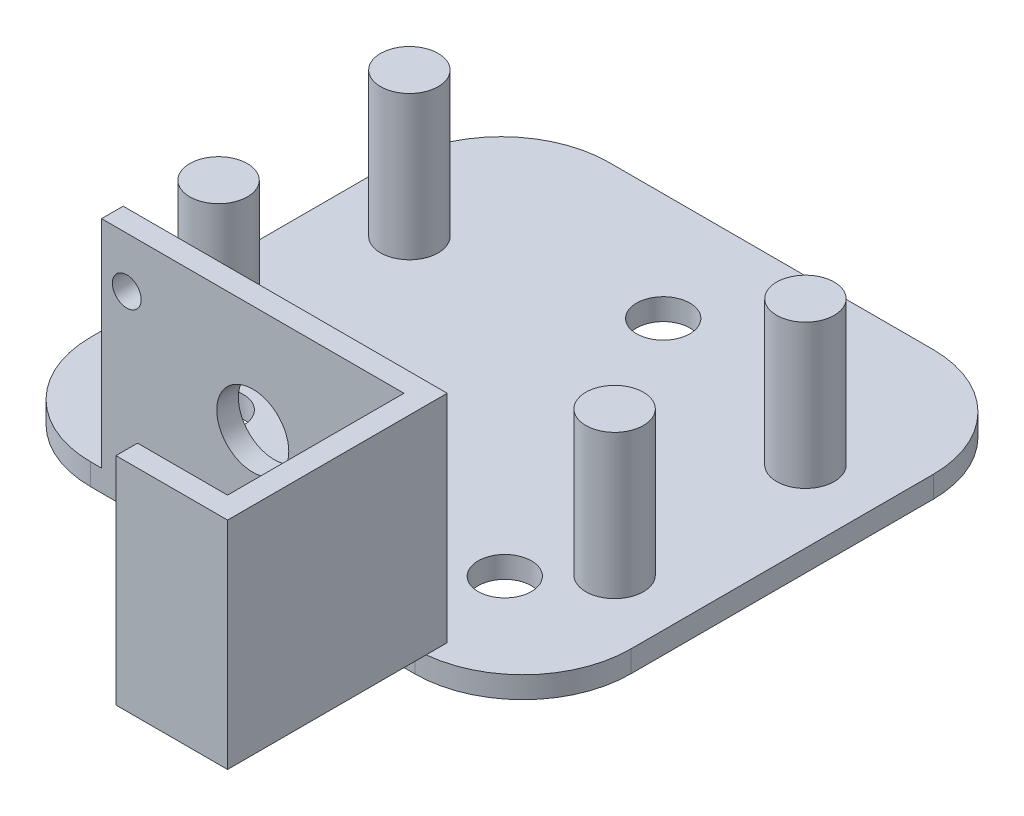
ISO-10303-21;
HEADER;
FILE_DESCRIPTION(('STEP AP214'),'2;1');
FILE_NAME('part.step','',(''),(''),'','','');
FILE_SCHEMA(('AUTOMOTIVE_DESIGN { 1 0 10303 214 1 1 1 1 }'));
ENDSEC;
DATA;
#1=APPLICATION_CONTEXT('core data for automotive mechanical design processes');
#2=APPLICATION_PROTOCOL_DEFINITION('international standard','automotive_design',2000,#1);
#3=PRODUCT_CONTEXT('',#1,'mechanical');
#4=PRODUCT('Part','Part','',(#3));
#5=PRODUCT_RELATED_PRODUCT_CATEGORY('part','',(#4));
#6=PRODUCT_DEFINITION_FORMATION('','',#4);
#7=PRODUCT_DEFINITION_CONTEXT('part definition',#1,'design');
#8=PRODUCT_DEFINITION('design','',#6,#7);
#9=PRODUCT_DEFINITION_SHAPE('','',#8);
#10=(LENGTH_UNIT() NAMED_UNIT(*) SI_UNIT(.MILLI.,.METRE.));
#11=(NAMED_UNIT(*) PLANE_ANGLE_UNIT() SI_UNIT($,.RADIAN.));
#12=(NAMED_UNIT(*) SI_UNIT($,.STERADIAN.) SOLID_ANGLE_UNIT());
#13=UNCERTAINTY_MEASURE_WITH_UNIT(LENGTH_MEASURE(1.E-05),#10,'distance_accuracy_value','');
#14=(GEOMETRIC_REPRESENTATION_CONTEXT(3) GLOBAL_UNCERTAINTY_ASSIGNED_CONTEXT((#13)) GLOBAL_UNIT_ASSIGNED_CONTEXT((#10,
#11,#12)) REPRESENTATION_CONTEXT('',''));
#15=CARTESIAN_POINT('',(0.,0.,0.));
#16=DIRECTION('',(0.,0.,1.));
#17=DIRECTION('',(1.,0.,0.));
#18=AXIS2_PLACEMENT_3D('',#15,#16,#17);
#19=CARTESIAN_POINT('',(21.,33.,0.));
#20=DIRECTION('',(-1.,0.,0.));
#21=DIRECTION('',(0.,0.,1.));
#22=AXIS2_PLACEMENT_3D('',#19,#20,#21);
#23=PLANE('',#22);
#24=DIRECTION('',(0.,0.,-1.));
#25=VECTOR('',#24,1.);
#26=CARTESIAN_POINT('',(21.,3.,0.));
#27=LINE('',#26,#25);
#28=CARTESIAN_POINT('',(21.,3.,60.5));
#29=VERTEX_POINT('',#28);
#30=CARTESIAN_POINT('',(21.,3.,36.));
#31=VERTEX_POINT('',#30);
#32=EDGE_CURVE('E220',#29,#31,#27,.T.);
#33=ORIENTED_EDGE('',*,*,#32,.F.);
#34=DIRECTION('',(0.,-1.,0.));
#35=VECTOR('',#34,1.);
#36=CARTESIAN_POINT('',(21.,33.,60.5));
#37=LINE('',#36,#35);
#38=CARTESIAN_POINT('',(21.,33.,60.5));
#39=VERTEX_POINT('',#38);
#40=EDGE_CURVE('E179',#39,#29,#37,.T.);
#41=ORIENTED_EDGE('',*,*,#40,.F.);
#42=DIRECTION('',(0.,0.,-1.));
#43=VECTOR('',#42,1.);
#44=CARTESIAN_POINT('',(21.,33.,0.));
#45=LINE('',#44,#43);
#46=CARTESIAN_POINT('',(21.,33.,36.));
#47=VERTEX_POINT('',#46);
#48=EDGE_CURVE('E164',#39,#47,#45,.T.);
#49=ORIENTED_EDGE('',*,*,#48,.T.);
#50=DIRECTION('',(0.,-1.,0.));
#51=VECTOR('',#50,1.);
#52=CARTESIAN_POINT('',(21.,33.,36.));
#53=LINE('',#52,#51);
#54=EDGE_CURVE('E228',#47,#31,#53,.T.);
#55=ORIENTED_EDGE('',*,*,#54,.T.);
#56=EDGE_LOOP('',(#33,#41,#49,#55));
#57=FACE_BOUND('',#56,.T.);
#58=ADVANCED_FACE('F37',(#57),#23,.T.);
#59=CARTESIAN_POINT('',(0.,3.,0.));
#60=DIRECTION('',(0.,1.,0.));
#61=DIRECTION('',(0.,0.,1.));
#62=AXIS2_PLACEMENT_3D('',#59,#60,#61);
#63=PLANE('',#62);
#64=CARTESIAN_POINT('',(-27.5,3.,-13.25));
#65=DIRECTION('',(0.,1.,0.));
#66=DIRECTION('',(0.,0.,1.));
#67=AXIS2_PLACEMENT_3D('',#64,#65,#66);
#68=CIRCLE('',#67,4.00000000000001);
#69=CARTESIAN_POINT('',(-27.5,3.,-9.24999999999999));
#70=VERTEX_POINT('',#69);
#71=EDGE_CURVE('E236',#70,#70,#68,.T.);
#72=ORIENTED_EDGE('',*,*,#71,.F.);
#73=EDGE_LOOP('',(#72));
#74=FACE_BOUND('',#73,.T.);
#75=CARTESIAN_POINT('',(27.5,3.,13.25));
#76=DIRECTION('',(0.,1.,0.));
#77=DIRECTION('',(0.,0.,1.));
#78=AXIS2_PLACEMENT_3D('',#75,#76,#77);
#79=CIRCLE('',#78,4.);
#80=CARTESIAN_POINT('',(27.5,3.,17.25));
#81=VERTEX_POINT('',#80);
#82=EDGE_CURVE('E45',#81,#81,#79,.T.);
#83=ORIENTED_EDGE('',*,*,#82,.F.);
#84=EDGE_LOOP('',(#83));
#85=FACE_BOUND('',#84,.T.);
#86=CARTESIAN_POINT('',(-27.5,3.,13.25));
#87=DIRECTION('',(0.,1.,0.));
#88=DIRECTION('',(0.,0.,1.));
#89=AXIS2_PLACEMENT_3D('',#86,#87,#88);
#90=CIRCLE('',#89,4.);
#91=CARTESIAN_POINT('',(-27.5,3.,17.25));
#92=VERTEX_POINT('',#91);
#93=EDGE_CURVE('E337',#92,#92,#90,.T.);
#94=ORIENTED_EDGE('',*,*,#93,.F.);
#95=EDGE_LOOP('',(#94));
#96=FACE_BOUND('',#95,.T.);
#97=CARTESIAN_POINT('',(27.5,3.,-13.25));
#98=DIRECTION('',(0.,1.,0.));
#99=DIRECTION('',(0.,0.,1.));
#100=AXIS2_PLACEMENT_3D('',#97,#98,#99);
#101=CIRCLE('',#100,4.);
#102=CARTESIAN_POINT('',(27.5,3.,-9.25));
#103=VERTEX_POINT('',#102);
#104=EDGE_CURVE('E248',#103,#103,#101,.T.);
#105=ORIENTED_EDGE('',*,*,#104,.F.);
#106=EDGE_LOOP('',(#105));
#107=FACE_BOUND('',#106,.T.);
#108=CARTESIAN_POINT('',(20.,3.,21.));
#109=DIRECTION('',(0.,1.,0.));
#110=DIRECTION('',(0.,0.,1.));
#111=AXIS2_PLACEMENT_3D('',#108,#109,#110);
#112=CIRCLE('',#111,3.7);
#113=CARTESIAN_POINT('',(20.,3.,24.7));
#114=VERTEX_POINT('',#113);
#115=EDGE_CURVE('E255',#114,#114,#112,.T.);
#116=ORIENTED_EDGE('',*,*,#115,.F.);
#117=EDGE_LOOP('',(#116));
#118=FACE_BOUND('',#117,.T.);
#119=CARTESIAN_POINT('',(-20.,3.,21.));
#120=DIRECTION('',(0.,1.,0.));
#121=DIRECTION('',(0.,0.,1.));
#122=AXIS2_PLACEMENT_3D('',#119,#120,#121);
#123=CIRCLE('',#122,3.70000000000001);
#124=CARTESIAN_POINT('',(-20.,3.,24.7));
#125=VERTEX_POINT('',#124);
#126=EDGE_CURVE('E258',#125,#125,#123,.T.);
#127=ORIENTED_EDGE('',*,*,#126,.F.);
#128=EDGE_LOOP('',(#127));
#129=FACE_BOUND('',#128,.T.);
#130=CARTESIAN_POINT('',(0.,3.,-21.));
#131=DIRECTION('',(0.,1.,0.));
#132=DIRECTION('',(0.,0.,1.));
#133=AXIS2_PLACEMENT_3D('',#130,#131,#132);
#134=CIRCLE('',#133,3.7);
#135=CARTESIAN_POINT('',(0.,3.,-17.3));
#136=VERTEX_POINT('',#135);
#137=EDGE_CURVE('E262',#136,#136,#134,.T.);
#138=ORIENTED_EDGE('',*,*,#137,.F.);
#139=EDGE_LOOP('',(#138));
#140=FACE_BOUND('',#139,.T.);
#141=DIRECTION('',(-1.,0.,0.));
#142=VECTOR('',#141,1.);
#143=CARTESIAN_POINT('',(0.,3.,36.));
#144=LINE('',#143,#142);
#145=CARTESIAN_POINT('',(-21.,3.,36.));
#146=VERTEX_POINT('',#145);
#147=CARTESIAN_POINT('',(-22.5,3.,36.));
#148=VERTEX_POINT('',#147);
#149=EDGE_CURVE('E282',#146,#148,#144,.T.);
#150=ORIENTED_EDGE('',*,*,#149,.F.);
#151=DIRECTION('',(0.,0.,1.));
#152=VECTOR('',#151,1.);
#153=CARTESIAN_POINT('',(-21.,3.,0.));
#154=LINE('',#153,#152);
#155=CARTESIAN_POINT('',(-21.,3.,33.));
#156=VERTEX_POINT('',#155);
#157=EDGE_CURVE('E218',#156,#146,#154,.T.);
#158=ORIENTED_EDGE('',*,*,#157,.F.);
#159=DIRECTION('',(-1.,0.,0.));
#160=VECTOR('',#159,1.);
#161=CARTESIAN_POINT('',(0.,3.,33.));
#162=LINE('',#161,#160);
#163=CARTESIAN_POINT('',(24.,3.,33.));
#164=VERTEX_POINT('',#163);
#165=EDGE_CURVE('E195',#164,#156,#162,.T.);
#166=ORIENTED_EDGE('',*,*,#165,.F.);
#167=DIRECTION('',(0.,0.,1.));
#168=VECTOR('',#167,1.);
#169=CARTESIAN_POINT('',(24.,3.,0.));
#170=LINE('',#169,#168);
#171=CARTESIAN_POINT('',(24.,3.,35.9248115565993));
#172=VERTEX_POINT('',#171);
#173=EDGE_CURVE('E11',#164,#172,#170,.T.);
#174=ORIENTED_EDGE('',*,*,#173,.T.);
#175=CARTESIAN_POINT('',(22.5,3.,21.));
#176=DIRECTION('',(0.,1.,0.));
#177=DIRECTION('',(0.,0.,1.));
#178=AXIS2_PLACEMENT_3D('',#175,#176,#177);
#179=CIRCLE('',#178,15.);
#180=CARTESIAN_POINT('',(37.5,3.,21.));
#181=VERTEX_POINT('',#180);
#182=EDGE_CURVE('E287',#181,#172,#179,.F.);
#183=ORIENTED_EDGE('',*,*,#182,.F.);
#184=DIRECTION('',(0.,0.,1.));
#185=VECTOR('',#184,1.);
#186=CARTESIAN_POINT('',(37.5,3.,0.));
#187=LINE('',#186,#185);
#188=CARTESIAN_POINT('',(37.5,3.,-21.));
#189=VERTEX_POINT('',#188);
#190=EDGE_CURVE('E265',#189,#181,#187,.T.);
#191=ORIENTED_EDGE('',*,*,#190,.F.);
#192=CARTESIAN_POINT('',(22.5,3.,-21.));
#193=DIRECTION('',(0.,1.,0.));
#194=DIRECTION('',(0.,0.,1.));
#195=AXIS2_PLACEMENT_3D('',#192,#193,#194);
#196=CIRCLE('',#195,15.);
#197=CARTESIAN_POINT('',(22.5,3.,-36.));
#198=VERTEX_POINT('',#197);
#199=EDGE_CURVE('E268',#189,#198,#196,.T.);
#200=ORIENTED_EDGE('',*,*,#199,.T.);
#201=DIRECTION('',(1.,0.,0.));
#202=VECTOR('',#201,1.);
#203=CARTESIAN_POINT('',(0.,3.,-36.));
#204=LINE('',#203,#202);
#205=CARTESIAN_POINT('',(-22.5,3.,-36.));
#206=VERTEX_POINT('',#205);
#207=EDGE_CURVE('E270',#206,#198,#204,.T.);
#208=ORIENTED_EDGE('',*,*,#207,.F.);
#209=CARTESIAN_POINT('',(-22.5,3.,-21.));
#210=DIRECTION('',(0.,1.,0.));
#211=DIRECTION('',(0.,0.,1.));
#212=AXIS2_PLACEMENT_3D('',#209,#210,#211);
#213=CIRCLE('',#212,15.);
#214=CARTESIAN_POINT('',(-37.5,3.,-21.));
#215=VERTEX_POINT('',#214);
#216=EDGE_CURVE('E273',#215,#206,#213,.F.);
#217=ORIENTED_EDGE('',*,*,#216,.F.);
#218=DIRECTION('',(0.,0.,-1.));
#219=VECTOR('',#218,1.);
#220=CARTESIAN_POINT('',(-37.5,3.,0.));
#221=LINE('',#220,#219);
#222=CARTESIAN_POINT('',(-37.5,3.,21.));
#223=VERTEX_POINT('',#222);
#224=EDGE_CURVE('E276',#223,#215,#221,.T.);
#225=ORIENTED_EDGE('',*,*,#224,.F.);
#226=CARTESIAN_POINT('',(-22.5,3.,21.));
#227=DIRECTION('',(0.,1.,0.));
#228=DIRECTION('',(0.,0.,1.));
#229=AXIS2_PLACEMENT_3D('',#226,#227,#228);
#230=CIRCLE('',#229,15.);
#231=EDGE_CURVE('E279',#223,#148,#230,.T.);
#232=ORIENTED_EDGE('',*,*,#231,.T.);
#233=EDGE_LOOP('',(#150,#158,#166,#174,#183,#191,#200,#208,#217,#225,#232));
#234=FACE_BOUND('',#233,.T.);
#235=ADVANCED_FACE('F344',(#74,#85,#96,#107,#118,#129,#140,#234),#63,.T.);
#236=CARTESIAN_POINT('',(37.5,3.,0.));
#237=DIRECTION('',(1.,0.,0.));
#238=DIRECTION('',(0.,0.,-1.));
#239=AXIS2_PLACEMENT_3D('',#236,#237,#238);
#240=PLANE('',#239);
#241=DIRECTION('',(0.,0.,1.));
#242=VECTOR('',#241,1.);
#243=CARTESIAN_POINT('',(37.5,0.,0.));
#244=LINE('',#243,#242);
#245=CARTESIAN_POINT('',(37.5,0.,-21.));
#246=VERTEX_POINT('',#245);
#247=CARTESIAN_POINT('',(37.5,0.,21.));
#248=VERTEX_POINT('',#247);
#249=EDGE_CURVE('E299',#246,#248,#244,.T.);
#250=ORIENTED_EDGE('',*,*,#249,.F.);
#251=DIRECTION('',(0.,-1.,0.));
#252=VECTOR('',#251,1.);
#253=CARTESIAN_POINT('',(37.5,3.,-21.));
#254=LINE('',#253,#252);
#255=EDGE_CURVE('E335',#189,#246,#254,.T.);
#256=ORIENTED_EDGE('',*,*,#255,.F.);
#257=ORIENTED_EDGE('',*,*,#190,.T.);
#258=DIRECTION('',(0.,-1.,0.));
#259=VECTOR('',#258,1.);
#260=CARTESIAN_POINT('',(37.5,3.,21.));
#261=LINE('',#260,#259);
#262=EDGE_CURVE('E290',#181,#248,#261,.T.);
#263=ORIENTED_EDGE('',*,*,#262,.T.);
#264=EDGE_LOOP('',(#250,#256,#257,#263));
#265=FACE_BOUND('',#264,.T.);
#266=ADVANCED_FACE('F347',(#265),#240,.T.);
#267=CARTESIAN_POINT('',(22.5,3.,-21.));
#268=DIRECTION('',(0.,-1.,0.));
#269=DIRECTION('',(0.,0.,-1.));
#270=AXIS2_PLACEMENT_3D('',#267,#268,#269);
#271=CYLINDRICAL_SURFACE('',#270,15.);
#272=CARTESIAN_POINT('',(22.5,0.,-21.));
#273=DIRECTION('',(0.,1.,0.));
#274=DIRECTION('',(0.,0.,1.));
#275=AXIS2_PLACEMENT_3D('',#272,#273,#274);
#276=CIRCLE('',#275,15.);
#277=CARTESIAN_POINT('',(22.5,0.,-36.));
#278=VERTEX_POINT('',#277);
#279=EDGE_CURVE('E302',#246,#278,#276,.T.);
#280=ORIENTED_EDGE('',*,*,#279,.T.);
#281=DIRECTION('',(0.,-1.,0.));
#282=VECTOR('',#281,1.);
#283=CARTESIAN_POINT('',(22.5,3.,-36.));
#284=LINE('',#283,#282);
#285=EDGE_CURVE('E333',#198,#278,#284,.T.);
#286=ORIENTED_EDGE('',*,*,#285,.F.);
#287=ORIENTED_EDGE('',*,*,#199,.F.);
#288=ORIENTED_EDGE('',*,*,#255,.T.);
#289=EDGE_LOOP('',(#280,#286,#287,#288));
#290=FACE_BOUND('',#289,.T.);
#291=ADVANCED_FACE('F393',(#290),#271,.T.);
#292=CARTESIAN_POINT('',(0.,3.,-36.));
#293=DIRECTION('',(0.,0.,-1.));
#294=DIRECTION('',(-1.,0.,0.));
#295=AXIS2_PLACEMENT_3D('',#292,#293,#294);
#296=PLANE('',#295);
#297=DIRECTION('',(1.,0.,0.));
#298=VECTOR('',#297,1.);
#299=CARTESIAN_POINT('',(0.,0.,-36.));
#300=LINE('',#299,#298);
#301=CARTESIAN_POINT('',(-22.5,0.,-36.));
#302=VERTEX_POINT('',#301);
#303=EDGE_CURVE('E305',#302,#278,#300,.T.);
#304=ORIENTED_EDGE('',*,*,#303,.F.);
#305=DIRECTION('',(0.,-1.,0.));
#306=VECTOR('',#305,1.);
#307=CARTESIAN_POINT('',(-22.5,3.,-36.));
#308=LINE('',#307,#306);
#309=EDGE_CURVE('E331',#206,#302,#308,.T.);
#310=ORIENTED_EDGE('',*,*,#309,.F.);
#311=ORIENTED_EDGE('',*,*,#207,.T.);
#312=ORIENTED_EDGE('',*,*,#285,.T.);
#313=EDGE_LOOP('',(#304,#310,#311,#312));
#314=FACE_BOUND('',#313,.T.);
#315=ADVANCED_FACE('F397',(#314),#296,.T.);
#316=CARTESIAN_POINT('',(-22.5,3.,-21.));
#317=DIRECTION('',(0.,-1.,0.));
#318=DIRECTION('',(0.,0.,-1.));
#319=AXIS2_PLACEMENT_3D('',#316,#317,#318);
#320=CYLINDRICAL_SURFACE('',#319,15.);
#321=CARTESIAN_POINT('',(-22.5,0.,-21.));
#322=DIRECTION('',(0.,1.,0.));
#323=DIRECTION('',(0.,0.,1.));
#324=AXIS2_PLACEMENT_3D('',#321,#322,#323);
#325=CIRCLE('',#324,15.);
#326=CARTESIAN_POINT('',(-37.5,0.,-21.));
#327=VERTEX_POINT('',#326);
#328=EDGE_CURVE('E308',#327,#302,#325,.F.);
#329=ORIENTED_EDGE('',*,*,#328,.F.);
#330=DIRECTION('',(0.,-1.,0.));
#331=VECTOR('',#330,1.);
#332=CARTESIAN_POINT('',(-37.5,3.,-21.));
#333=LINE('',#332,#331);
#334=EDGE_CURVE('E329',#215,#327,#333,.T.);
#335=ORIENTED_EDGE('',*,*,#334,.F.);
#336=ORIENTED_EDGE('',*,*,#216,.T.);
#337=ORIENTED_EDGE('',*,*,#309,.T.);
#338=EDGE_LOOP('',(#329,#335,#336,#337));
#339=FACE_BOUND('',#338,.T.);
#340=ADVANCED_FACE('F400',(#339),#320,.T.);
#341=CARTESIAN_POINT('',(-37.5,3.,0.));
#342=DIRECTION('',(-1.,0.,0.));
#343=DIRECTION('',(0.,0.,1.));
#344=AXIS2_PLACEMENT_3D('',#341,#342,#343);
#345=PLANE('',#344);
#346=DIRECTION('',(0.,0.,-1.));
#347=VECTOR('',#346,1.);
#348=CARTESIAN_POINT('',(-37.5,0.,0.));
#349=LINE('',#348,#347);
#350=CARTESIAN_POINT('',(-37.5,0.,21.));
#351=VERTEX_POINT('',#350);
#352=EDGE_CURVE('E311',#351,#327,#349,.T.);
#353=ORIENTED_EDGE('',*,*,#352,.F.);
#354=DIRECTION('',(0.,-1.,0.));
#355=VECTOR('',#354,1.);
#356=CARTESIAN_POINT('',(-37.5,3.,21.));
#357=LINE('',#356,#355);
#358=EDGE_CURVE('E327',#223,#351,#357,.T.);
#359=ORIENTED_EDGE('',*,*,#358,.F.);
#360=ORIENTED_EDGE('',*,*,#224,.T.);
#361=ORIENTED_EDGE('',*,*,#334,.T.);
#362=EDGE_LOOP('',(#353,#359,#360,#361));
#363=FACE_BOUND('',#362,.T.);
#364=ADVANCED_FACE('F403',(#363),#345,.T.);
#365=CARTESIAN_POINT('',(-22.5,3.,21.));
#366=DIRECTION('',(0.,-1.,0.));
#367=DIRECTION('',(0.,0.,-1.));
#368=AXIS2_PLACEMENT_3D('',#365,#366,#367);
#369=CYLINDRICAL_SURFACE('',#368,15.);
#370=CARTESIAN_POINT('',(-22.5,0.,21.));
#371=DIRECTION('',(0.,1.,0.));
#372=DIRECTION('',(0.,0.,1.));
#373=AXIS2_PLACEMENT_3D('',#370,#371,#372);
#374=CIRCLE('',#373,15.);
#375=CARTESIAN_POINT('',(-22.5,0.,36.));
#376=VERTEX_POINT('',#375);
#377=EDGE_CURVE('E314',#351,#376,#374,.T.);
#378=ORIENTED_EDGE('',*,*,#377,.T.);
#379=DIRECTION('',(0.,-1.,0.));
#380=VECTOR('',#379,1.);
#381=CARTESIAN_POINT('',(-22.5,3.,36.));
#382=LINE('',#381,#380);
#383=EDGE_CURVE('E325',#148,#376,#382,.T.);
#384=ORIENTED_EDGE('',*,*,#383,.F.);
#385=ORIENTED_EDGE('',*,*,#231,.F.);
#386=ORIENTED_EDGE('',*,*,#358,.T.);
#387=EDGE_LOOP('',(#378,#384,#385,#386));
#388=FACE_BOUND('',#387,.T.);
#389=ADVANCED_FACE('F406',(#388),#369,.T.);
#390=CARTESIAN_POINT('',(0.,3.,36.));
#391=DIRECTION('',(0.,0.,1.));
#392=DIRECTION('',(1.,0.,0.));
#393=AXIS2_PLACEMENT_3D('',#390,#391,#392);
#394=PLANE('',#393);
#395=CARTESIAN_POINT('',(17.5,26.,36.));
#396=DIRECTION('',(0.,0.,1.));
#397=DIRECTION('',(1.,0.,0.));
#398=AXIS2_PLACEMENT_3D('',#395,#396,#397);
#399=CIRCLE('',#398,2.00000000000001);
#400=CARTESIAN_POINT('',(19.5,26.,36.));
#401=VERTEX_POINT('',#400);
#402=EDGE_CURVE('E188',#401,#401,#399,.T.);
#403=ORIENTED_EDGE('',*,*,#402,.F.);
#404=EDGE_LOOP('',(#403));
#405=FACE_BOUND('',#404,.T.);
#406=CARTESIAN_POINT('',(0.,18.,36.));
#407=DIRECTION('',(0.,0.,1.));
#408=DIRECTION('',(1.,0.,0.));
#409=AXIS2_PLACEMENT_3D('',#406,#407,#408);
#410=CIRCLE('',#409,5.);
#411=CARTESIAN_POINT('',(5.00000000000001,18.,36.));
#412=VERTEX_POINT('',#411);
#413=EDGE_CURVE('E196',#412,#412,#410,.T.);
#414=ORIENTED_EDGE('',*,*,#413,.F.);
#415=EDGE_LOOP('',(#414));
#416=FACE_BOUND('',#415,.T.);
#417=CARTESIAN_POINT('',(-17.5,26.,36.));
#418=DIRECTION('',(0.,0.,1.));
#419=DIRECTION('',(1.,0.,0.));
#420=AXIS2_PLACEMENT_3D('',#417,#418,#419);
#421=CIRCLE('',#420,2.00000000000001);
#422=CARTESIAN_POINT('',(-15.5,26.,36.));
#423=VERTEX_POINT('',#422);
#424=EDGE_CURVE('E187',#423,#423,#421,.T.);
#425=ORIENTED_EDGE('',*,*,#424,.F.);
#426=EDGE_LOOP('',(#425));
#427=FACE_BOUND('',#426,.T.);
#428=DIRECTION('',(-1.,0.,0.));
#429=VECTOR('',#428,1.);
#430=CARTESIAN_POINT('',(0.,0.,36.));
#431=LINE('',#430,#429);
#432=CARTESIAN_POINT('',(22.5,0.,36.));
#433=VERTEX_POINT('',#432);
#434=EDGE_CURVE('E317',#433,#376,#431,.T.);
#435=ORIENTED_EDGE('',*,*,#434,.F.);
#436=DIRECTION('',(0.,-1.,0.));
#437=VECTOR('',#436,1.);
#438=CARTESIAN_POINT('',(22.5,3.,36.));
#439=LINE('',#438,#437);
#440=CARTESIAN_POINT('',(22.5,3.,36.));
#441=VERTEX_POINT('',#440);
#442=EDGE_CURVE('E323',#441,#433,#439,.T.);
#443=ORIENTED_EDGE('',*,*,#442,.F.);
#444=EDGE_CURVE('E283',#441,#31,#144,.T.);
#445=ORIENTED_EDGE('',*,*,#444,.T.);
#446=ORIENTED_EDGE('',*,*,#54,.F.);
#447=DIRECTION('',(1.,0.,0.));
#448=VECTOR('',#447,1.);
#449=CARTESIAN_POINT('',(0.,33.,36.));
#450=LINE('',#449,#448);
#451=CARTESIAN_POINT('',(-21.,33.,36.));
#452=VERTEX_POINT('',#451);
#453=EDGE_CURVE('E210',#452,#47,#450,.T.);
#454=ORIENTED_EDGE('',*,*,#453,.F.);
#455=DIRECTION('',(0.,-1.,0.));
#456=VECTOR('',#455,1.);
#457=CARTESIAN_POINT('',(-21.,33.,36.));
#458=LINE('',#457,#456);
#459=EDGE_CURVE('E231',#452,#146,#458,.T.);
#460=ORIENTED_EDGE('',*,*,#459,.T.);
#461=ORIENTED_EDGE('',*,*,#149,.T.);
#462=ORIENTED_EDGE('',*,*,#383,.T.);
#463=EDGE_LOOP('',(#435,#443,#445,#446,#454,#460,#461,#462));
#464=FACE_BOUND('',#463,.T.);
#465=ADVANCED_FACE('F368',(#405,#416,#427,#464),#394,.T.);
#466=CARTESIAN_POINT('',(0.,3.,-21.));
#467=DIRECTION('',(0.,-1.,0.));
#468=DIRECTION('',(0.,0.,-1.));
#469=AXIS2_PLACEMENT_3D('',#466,#467,#468);
#470=CYLINDRICAL_SURFACE('',#469,3.7);
#471=ORIENTED_EDGE('',*,*,#137,.T.);
#472=EDGE_LOOP('',(#471));
#473=FACE_BOUND('',#472,.T.);
#474=CARTESIAN_POINT('',(0.,0.,-21.));
#475=DIRECTION('',(0.,1.,0.));
#476=DIRECTION('',(0.,0.,1.));
#477=AXIS2_PLACEMENT_3D('',#474,#475,#476);
#478=CIRCLE('',#477,3.7);
#479=CARTESIAN_POINT('',(0.,0.,-17.3));
#480=VERTEX_POINT('',#479);
#481=EDGE_CURVE('E296',#480,#480,#478,.T.);
#482=ORIENTED_EDGE('',*,*,#481,.F.);
#483=EDGE_LOOP('',(#482));
#484=FACE_BOUND('',#483,.T.);
#485=ADVANCED_FACE('F471',(#473,#484),#470,.F.);
#486=CARTESIAN_POINT('',(-20.,3.,21.));
#487=DIRECTION('',(0.,-1.,0.));
#488=DIRECTION('',(0.,0.,-1.));
#489=AXIS2_PLACEMENT_3D('',#486,#487,#488);
#490=CYLINDRICAL_SURFACE('',#489,3.70000000000001);
#491=ORIENTED_EDGE('',*,*,#126,.T.);
#492=EDGE_LOOP('',(#491));
#493=FACE_BOUND('',#492,.T.);
#494=CARTESIAN_POINT('',(-20.,0.,21.));
#495=DIRECTION('',(0.,1.,0.));
#496=DIRECTION('',(0.,0.,1.));
#497=AXIS2_PLACEMENT_3D('',#494,#495,#496);
#498=CIRCLE('',#497,3.70000000000001);
#499=CARTESIAN_POINT('',(-20.,0.,24.7));
#500=VERTEX_POINT('',#499);
#501=EDGE_CURVE('E293',#500,#500,#498,.T.);
#502=ORIENTED_EDGE('',*,*,#501,.F.);
#503=EDGE_LOOP('',(#502));
#504=FACE_BOUND('',#503,.T.);
#505=ADVANCED_FACE('F486',(#493,#504),#490,.F.);
#506=CARTESIAN_POINT('',(20.,3.,21.));
#507=DIRECTION('',(0.,-1.,0.));
#508=DIRECTION('',(0.,0.,-1.));
#509=AXIS2_PLACEMENT_3D('',#506,#507,#508);
#510=CYLINDRICAL_SURFACE('',#509,3.7);
#511=ORIENTED_EDGE('',*,*,#115,.T.);
#512=EDGE_LOOP('',(#511));
#513=FACE_BOUND('',#512,.T.);
#514=CARTESIAN_POINT('',(20.,0.,21.));
#515=DIRECTION('',(0.,1.,0.));
#516=DIRECTION('',(0.,0.,1.));
#517=AXIS2_PLACEMENT_3D('',#514,#515,#516);
#518=CIRCLE('',#517,3.7);
#519=CARTESIAN_POINT('',(20.,0.,24.7));
#520=VERTEX_POINT('',#519);
#521=EDGE_CURVE('E252',#520,#520,#518,.T.);
#522=ORIENTED_EDGE('',*,*,#521,.F.);
#523=EDGE_LOOP('',(#522));
#524=FACE_BOUND('',#523,.T.);
#525=ADVANCED_FACE('F39',(#513,#524),#510,.F.);
#526=CARTESIAN_POINT('',(22.5,3.,21.));
#527=DIRECTION('',(0.,-1.,0.));
#528=DIRECTION('',(0.,0.,-1.));
#529=AXIS2_PLACEMENT_3D('',#526,#527,#528);
#530=CYLINDRICAL_SURFACE('',#529,15.);
#531=CARTESIAN_POINT('',(22.5,0.,21.));
#532=DIRECTION('',(0.,1.,0.));
#533=DIRECTION('',(0.,0.,1.));
#534=AXIS2_PLACEMENT_3D('',#531,#532,#533);
#535=CIRCLE('',#534,15.);
#536=EDGE_CURVE('E259',#248,#433,#535,.F.);
#537=ORIENTED_EDGE('',*,*,#536,.F.);
#538=ORIENTED_EDGE('',*,*,#262,.F.);
#539=ORIENTED_EDGE('',*,*,#182,.T.);
#540=EDGE_CURVE('E286',#172,#441,#179,.F.);
#541=ORIENTED_EDGE('',*,*,#540,.T.);
#542=ORIENTED_EDGE('',*,*,#442,.T.);
#543=EDGE_LOOP('',(#537,#538,#539,#541,#542));
#544=FACE_BOUND('',#543,.T.);
#545=ADVANCED_FACE('F384',(#544),#530,.T.);
#546=CARTESIAN_POINT('',(0.,0.,0.));
#547=DIRECTION('',(0.,1.,0.));
#548=DIRECTION('',(0.,0.,1.));
#549=AXIS2_PLACEMENT_3D('',#546,#547,#548);
#550=PLANE('',#549);
#551=ORIENTED_EDGE('',*,*,#521,.T.);
#552=EDGE_LOOP('',(#551));
#553=FACE_BOUND('',#552,.T.);
#554=ORIENTED_EDGE('',*,*,#501,.T.);
#555=EDGE_LOOP('',(#554));
#556=FACE_BOUND('',#555,.T.);
#557=ORIENTED_EDGE('',*,*,#481,.T.);
#558=EDGE_LOOP('',(#557));
#559=FACE_BOUND('',#558,.T.);
#560=ORIENTED_EDGE('',*,*,#249,.T.);
#561=ORIENTED_EDGE('',*,*,#536,.T.);
#562=ORIENTED_EDGE('',*,*,#434,.T.);
#563=ORIENTED_EDGE('',*,*,#377,.F.);
#564=ORIENTED_EDGE('',*,*,#352,.T.);
#565=ORIENTED_EDGE('',*,*,#328,.T.);
#566=ORIENTED_EDGE('',*,*,#303,.T.);
#567=ORIENTED_EDGE('',*,*,#279,.F.);
#568=EDGE_LOOP('',(#560,#561,#562,#563,#564,#565,#566,#567));
#569=FACE_BOUND('',#568,.T.);
#570=ADVANCED_FACE('F408',(#553,#556,#559,#569),#550,.F.);
#571=CARTESIAN_POINT('',(27.5,23.,-13.25));
#572=DIRECTION('',(0.,-1.,0.));
#573=DIRECTION('',(0.,0.,-1.));
#574=AXIS2_PLACEMENT_3D('',#571,#572,#573);
#575=CYLINDRICAL_SURFACE('',#574,4.);
#576=CARTESIAN_POINT('',(27.5,23.,-13.25));
#577=DIRECTION('',(0.,1.,0.));
#578=DIRECTION('',(0.,0.,1.));
#579=AXIS2_PLACEMENT_3D('',#576,#577,#578);
#580=CIRCLE('',#579,4.);
#581=CARTESIAN_POINT('',(27.5,23.,-9.25));
#582=VERTEX_POINT('',#581);
#583=EDGE_CURVE('E249',#582,#582,#580,.T.);
#584=ORIENTED_EDGE('',*,*,#583,.F.);
#585=EDGE_LOOP('',(#584));
#586=FACE_BOUND('',#585,.T.);
#587=ORIENTED_EDGE('',*,*,#104,.T.);
#588=EDGE_LOOP('',(#587));
#589=FACE_BOUND('',#588,.T.);
#590=ADVANCED_FACE('F459',(#586,#589),#575,.T.);
#591=CARTESIAN_POINT('',(0.,23.,0.));
#592=DIRECTION('',(0.,1.,0.));
#593=DIRECTION('',(0.,0.,1.));
#594=AXIS2_PLACEMENT_3D('',#591,#592,#593);
#595=PLANE('',#594);
#596=ORIENTED_EDGE('',*,*,#583,.T.);
#597=EDGE_LOOP('',(#596));
#598=FACE_BOUND('',#597,.T.);
#599=ADVANCED_FACE('F455',(#598),#595,.T.);
#600=CARTESIAN_POINT('',(-27.5,23.,13.25));
#601=DIRECTION('',(0.,-1.,0.));
#602=DIRECTION('',(0.,0.,-1.));
#603=AXIS2_PLACEMENT_3D('',#600,#601,#602);
#604=CYLINDRICAL_SURFACE('',#603,4.);
#605=CARTESIAN_POINT('',(-27.5,23.,13.25));
#606=DIRECTION('',(0.,1.,0.));
#607=DIRECTION('',(0.,0.,1.));
#608=AXIS2_PLACEMENT_3D('',#605,#606,#607);
#609=CIRCLE('',#608,4.);
#610=CARTESIAN_POINT('',(-27.5,23.,17.25));
#611=VERTEX_POINT('',#610);
#612=EDGE_CURVE('E245',#611,#611,#609,.F.);
#613=ORIENTED_EDGE('',*,*,#612,.T.);
#614=EDGE_LOOP('',(#613));
#615=FACE_BOUND('',#614,.T.);
#616=ORIENTED_EDGE('',*,*,#93,.T.);
#617=EDGE_LOOP('',(#616));
#618=FACE_BOUND('',#617,.T.);
#619=ADVANCED_FACE('F451',(#615,#618),#604,.T.);
#620=CARTESIAN_POINT('',(0.,23.,0.));
#621=DIRECTION('',(0.,1.,0.));
#622=DIRECTION('',(0.,0.,1.));
#623=AXIS2_PLACEMENT_3D('',#620,#621,#622);
#624=PLANE('',#623);
#625=ORIENTED_EDGE('',*,*,#612,.F.);
#626=EDGE_LOOP('',(#625));
#627=FACE_BOUND('',#626,.T.);
#628=ADVANCED_FACE('F447',(#627),#624,.T.);
#629=CARTESIAN_POINT('',(27.5,23.,13.25));
#630=DIRECTION('',(0.,-1.,0.));
#631=DIRECTION('',(0.,0.,-1.));
#632=AXIS2_PLACEMENT_3D('',#629,#630,#631);
#633=CYLINDRICAL_SURFACE('',#632,4.);
#634=CARTESIAN_POINT('',(27.5,23.,13.25));
#635=DIRECTION('',(0.,1.,0.));
#636=DIRECTION('',(0.,0.,1.));
#637=AXIS2_PLACEMENT_3D('',#634,#635,#636);
#638=CIRCLE('',#637,4.);
#639=CARTESIAN_POINT('',(27.5,23.,17.25));
#640=VERTEX_POINT('',#639);
#641=EDGE_CURVE('E240',#640,#640,#638,.F.);
#642=ORIENTED_EDGE('',*,*,#641,.T.);
#643=EDGE_LOOP('',(#642));
#644=FACE_BOUND('',#643,.T.);
#645=ORIENTED_EDGE('',*,*,#82,.T.);
#646=EDGE_LOOP('',(#645));
#647=FACE_BOUND('',#646,.T.);
#648=ADVANCED_FACE('F342',(#644,#647),#633,.T.);
#649=CARTESIAN_POINT('',(0.,23.,0.));
#650=DIRECTION('',(0.,1.,0.));
#651=DIRECTION('',(0.,0.,1.));
#652=AXIS2_PLACEMENT_3D('',#649,#650,#651);
#653=PLANE('',#652);
#654=ORIENTED_EDGE('',*,*,#641,.F.);
#655=EDGE_LOOP('',(#654));
#656=FACE_BOUND('',#655,.T.);
#657=ADVANCED_FACE('F440',(#656),#653,.T.);
#658=CARTESIAN_POINT('',(-27.5,23.,-13.25));
#659=DIRECTION('',(0.,-1.,0.));
#660=DIRECTION('',(0.,0.,-1.));
#661=AXIS2_PLACEMENT_3D('',#658,#659,#660);
#662=CYLINDRICAL_SURFACE('',#661,4.00000000000001);
#663=CARTESIAN_POINT('',(-27.5,23.,-13.25));
#664=DIRECTION('',(0.,1.,0.));
#665=DIRECTION('',(0.,0.,1.));
#666=AXIS2_PLACEMENT_3D('',#663,#664,#665);
#667=CIRCLE('',#666,4.00000000000001);
#668=CARTESIAN_POINT('',(-27.5,23.,-9.24999999999999));
#669=VERTEX_POINT('',#668);
#670=EDGE_CURVE('E237',#669,#669,#667,.T.);
#671=ORIENTED_EDGE('',*,*,#670,.F.);
#672=EDGE_LOOP('',(#671));
#673=FACE_BOUND('',#672,.T.);
#674=ORIENTED_EDGE('',*,*,#71,.T.);
#675=EDGE_LOOP('',(#674));
#676=FACE_BOUND('',#675,.T.);
#677=ADVANCED_FACE('F436',(#673,#676),#662,.T.);
#678=CARTESIAN_POINT('',(0.,23.,0.));
#679=DIRECTION('',(0.,1.,0.));
#680=DIRECTION('',(0.,0.,1.));
#681=AXIS2_PLACEMENT_3D('',#678,#679,#680);
#682=PLANE('',#681);
#683=ORIENTED_EDGE('',*,*,#670,.T.);
#684=EDGE_LOOP('',(#683));
#685=FACE_BOUND('',#684,.T.);
#686=ADVANCED_FACE('F432',(#685),#682,.T.);
#687=CARTESIAN_POINT('',(0.,33.,33.));
#688=DIRECTION('',(0.,0.,1.));
#689=DIRECTION('',(1.,0.,0.));
#690=AXIS2_PLACEMENT_3D('',#687,#688,#689);
#691=PLANE('',#690);
#692=CARTESIAN_POINT('',(17.5,26.,33.));
#693=DIRECTION('',(0.,0.,1.));
#694=DIRECTION('',(1.,0.,0.));
#695=AXIS2_PLACEMENT_3D('',#692,#693,#694);
#696=CIRCLE('',#695,2.00000000000001);
#697=CARTESIAN_POINT('',(19.5,26.,33.));
#698=VERTEX_POINT('',#697);
#699=EDGE_CURVE('E191',#698,#698,#696,.F.);
#700=ORIENTED_EDGE('',*,*,#699,.F.);
#701=EDGE_LOOP('',(#700));
#702=FACE_BOUND('',#701,.T.);
#703=CARTESIAN_POINT('',(0.,18.,33.));
#704=DIRECTION('',(0.,0.,1.));
#705=DIRECTION('',(1.,0.,0.));
#706=AXIS2_PLACEMENT_3D('',#703,#704,#705);
#707=CIRCLE('',#706,5.);
#708=CARTESIAN_POINT('',(5.00000000000001,18.,33.));
#709=VERTEX_POINT('',#708);
#710=EDGE_CURVE('E192',#709,#709,#707,.F.);
#711=ORIENTED_EDGE('',*,*,#710,.F.);
#712=EDGE_LOOP('',(#711));
#713=FACE_BOUND('',#712,.T.);
#714=CARTESIAN_POINT('',(-17.5,26.,33.));
#715=DIRECTION('',(0.,0.,1.));
#716=DIRECTION('',(1.,0.,0.));
#717=AXIS2_PLACEMENT_3D('',#714,#715,#716);
#718=CIRCLE('',#717,2.00000000000001);
#719=CARTESIAN_POINT('',(-15.5,26.,33.));
#720=VERTEX_POINT('',#719);
#721=EDGE_CURVE('E199',#720,#720,#718,.F.);
#722=ORIENTED_EDGE('',*,*,#721,.F.);
#723=EDGE_LOOP('',(#722));
#724=FACE_BOUND('',#723,.T.);
#725=ORIENTED_EDGE('',*,*,#165,.T.);
#726=DIRECTION('',(0.,-1.,0.));
#727=VECTOR('',#726,1.);
#728=CARTESIAN_POINT('',(-21.,33.,33.));
#729=LINE('',#728,#727);
#730=CARTESIAN_POINT('',(-21.,33.,33.));
#731=VERTEX_POINT('',#730);
#732=EDGE_CURVE('E234',#731,#156,#729,.T.);
#733=ORIENTED_EDGE('',*,*,#732,.F.);
#734=DIRECTION('',(-1.,0.,0.));
#735=VECTOR('',#734,1.);
#736=CARTESIAN_POINT('',(0.,33.,33.));
#737=LINE('',#736,#735);
#738=CARTESIAN_POINT('',(24.,33.,33.));
#739=VERTEX_POINT('',#738);
#740=EDGE_CURVE('E206',#739,#731,#737,.T.);
#741=ORIENTED_EDGE('',*,*,#740,.F.);
#742=DIRECTION('',(0.,-1.,0.));
#743=VECTOR('',#742,1.);
#744=CARTESIAN_POINT('',(24.,33.,33.));
#745=LINE('',#744,#743);
#746=EDGE_CURVE('E215',#739,#164,#745,.T.);
#747=ORIENTED_EDGE('',*,*,#746,.T.);
#748=EDGE_LOOP('',(#725,#733,#741,#747));
#749=FACE_BOUND('',#748,.T.);
#750=ADVANCED_FACE('F377',(#702,#713,#724,#749),#691,.F.);
#751=CARTESIAN_POINT('',(-21.,33.,0.));
#752=DIRECTION('',(1.,0.,0.));
#753=DIRECTION('',(0.,0.,-1.));
#754=AXIS2_PLACEMENT_3D('',#751,#752,#753);
#755=PLANE('',#754);
#756=ORIENTED_EDGE('',*,*,#157,.T.);
#757=ORIENTED_EDGE('',*,*,#459,.F.);
#758=DIRECTION('',(0.,0.,1.));
#759=VECTOR('',#758,1.);
#760=CARTESIAN_POINT('',(-21.,33.,0.));
#761=LINE('',#760,#759);
#762=EDGE_CURVE('E208',#731,#452,#761,.T.);
#763=ORIENTED_EDGE('',*,*,#762,.F.);
#764=ORIENTED_EDGE('',*,*,#732,.T.);
#765=EDGE_LOOP('',(#756,#757,#763,#764));
#766=FACE_BOUND('',#765,.T.);
#767=ADVANCED_FACE('F373',(#766),#755,.F.);
#768=CARTESIAN_POINT('',(0.,33.,63.5));
#769=DIRECTION('',(0.,0.,1.));
#770=DIRECTION('',(1.,0.,0.));
#771=AXIS2_PLACEMENT_3D('',#768,#769,#770);
#772=PLANE('',#771);
#773=DIRECTION('',(-1.,0.,0.));
#774=VECTOR('',#773,1.);
#775=CARTESIAN_POINT('',(0.,3.,63.5));
#776=LINE('',#775,#774);
#777=CARTESIAN_POINT('',(24.,3.,63.5));
#778=VERTEX_POINT('',#777);
#779=CARTESIAN_POINT('',(8.5,3.,63.5));
#780=VERTEX_POINT('',#779);
#781=EDGE_CURVE('E222',#778,#780,#776,.T.);
#782=ORIENTED_EDGE('',*,*,#781,.F.);
#783=DIRECTION('',(0.,-1.,0.));
#784=VECTOR('',#783,1.);
#785=CARTESIAN_POINT('',(24.,33.,63.5));
#786=LINE('',#785,#784);
#787=CARTESIAN_POINT('',(24.,33.,63.5));
#788=VERTEX_POINT('',#787);
#789=EDGE_CURVE('E160',#788,#778,#786,.T.);
#790=ORIENTED_EDGE('',*,*,#789,.F.);
#791=DIRECTION('',(-1.,0.,0.));
#792=VECTOR('',#791,1.);
#793=CARTESIAN_POINT('',(0.,33.,63.5));
#794=LINE('',#793,#792);
#795=CARTESIAN_POINT('',(8.5,33.,63.5));
#796=VERTEX_POINT('',#795);
#797=EDGE_CURVE('E154',#788,#796,#794,.T.);
#798=ORIENTED_EDGE('',*,*,#797,.T.);
#799=DIRECTION('',(0.,1.,0.));
#800=VECTOR('',#799,1.);
#801=CARTESIAN_POINT('',(8.5,33.,63.5));
#802=LINE('',#801,#800);
#803=EDGE_CURVE('E159',#780,#796,#802,.T.);
#804=ORIENTED_EDGE('',*,*,#803,.F.);
#805=EDGE_LOOP('',(#782,#790,#798,#804));
#806=FACE_BOUND('',#805,.T.);
#807=ADVANCED_FACE('F157',(#806),#772,.T.);
#808=CARTESIAN_POINT('',(24.,33.,0.));
#809=DIRECTION('',(-1.,0.,0.));
#810=DIRECTION('',(0.,0.,1.));
#811=AXIS2_PLACEMENT_3D('',#808,#809,#810);
#812=PLANE('',#811);
#813=DIRECTION('',(0.,0.,-1.));
#814=VECTOR('',#813,1.);
#815=CARTESIAN_POINT('',(24.,3.,0.));
#816=LINE('',#815,#814);
#817=EDGE_CURVE('E60',#778,#172,#816,.T.);
#818=ORIENTED_EDGE('',*,*,#817,.T.);
#819=ORIENTED_EDGE('',*,*,#173,.F.);
#820=ORIENTED_EDGE('',*,*,#746,.F.);
#821=DIRECTION('',(0.,0.,-1.));
#822=VECTOR('',#821,1.);
#823=CARTESIAN_POINT('',(24.,33.,0.));
#824=LINE('',#823,#822);
#825=EDGE_CURVE('E163',#788,#739,#824,.T.);
#826=ORIENTED_EDGE('',*,*,#825,.F.);
#827=ORIENTED_EDGE('',*,*,#789,.T.);
#828=EDGE_LOOP('',(#818,#819,#820,#826,#827));
#829=FACE_BOUND('',#828,.T.);
#830=ADVANCED_FACE('F413',(#829),#812,.F.);
#831=CARTESIAN_POINT('',(0.,33.,0.));
#832=DIRECTION('',(0.,1.,0.));
#833=DIRECTION('',(0.,0.,1.));
#834=AXIS2_PLACEMENT_3D('',#831,#832,#833);
#835=PLANE('',#834);
#836=ORIENTED_EDGE('',*,*,#740,.T.);
#837=ORIENTED_EDGE('',*,*,#762,.T.);
#838=ORIENTED_EDGE('',*,*,#453,.T.);
#839=ORIENTED_EDGE('',*,*,#48,.F.);
#840=DIRECTION('',(1.,0.,0.));
#841=VECTOR('',#840,1.);
#842=CARTESIAN_POINT('',(8.5,33.,60.5));
#843=LINE('',#842,#841);
#844=CARTESIAN_POINT('',(8.5,33.,60.5));
#845=VERTEX_POINT('',#844);
#846=EDGE_CURVE('E171',#845,#39,#843,.T.);
#847=ORIENTED_EDGE('',*,*,#846,.F.);
#848=DIRECTION('',(0.,0.,-1.));
#849=VECTOR('',#848,1.);
#850=CARTESIAN_POINT('',(8.5,33.,63.5));
#851=LINE('',#850,#849);
#852=EDGE_CURVE('E167',#796,#845,#851,.T.);
#853=ORIENTED_EDGE('',*,*,#852,.F.);
#854=ORIENTED_EDGE('',*,*,#797,.F.);
#855=ORIENTED_EDGE('',*,*,#825,.T.);
#856=EDGE_LOOP('',(#836,#837,#838,#839,#847,#853,#854,#855));
#857=FACE_BOUND('',#856,.T.);
#858=ADVANCED_FACE('F169',(#857),#835,.T.);
#859=CARTESIAN_POINT('',(0.,3.,0.));
#860=DIRECTION('',(0.,1.,0.));
#861=DIRECTION('',(0.,0.,1.));
#862=AXIS2_PLACEMENT_3D('',#859,#860,#861);
#863=PLANE('',#862);
#864=ORIENTED_EDGE('',*,*,#444,.F.);
#865=ORIENTED_EDGE('',*,*,#540,.F.);
#866=ORIENTED_EDGE('',*,*,#817,.F.);
#867=ORIENTED_EDGE('',*,*,#781,.T.);
#868=DIRECTION('',(0.,0.,1.));
#869=VECTOR('',#868,1.);
#870=CARTESIAN_POINT('',(8.5,3.,63.5));
#871=LINE('',#870,#869);
#872=CARTESIAN_POINT('',(8.5,3.,60.5));
#873=VERTEX_POINT('',#872);
#874=EDGE_CURVE('E178',#873,#780,#871,.T.);
#875=ORIENTED_EDGE('',*,*,#874,.F.);
#876=DIRECTION('',(1.,0.,0.));
#877=VECTOR('',#876,1.);
#878=CARTESIAN_POINT('',(8.5,3.,60.5));
#879=LINE('',#878,#877);
#880=EDGE_CURVE('E52',#873,#29,#879,.T.);
#881=ORIENTED_EDGE('',*,*,#880,.T.);
#882=ORIENTED_EDGE('',*,*,#32,.T.);
#883=EDGE_LOOP('',(#864,#865,#866,#867,#875,#881,#882));
#884=FACE_BOUND('',#883,.T.);
#885=ADVANCED_FACE('F409',(#884),#863,.F.);
#886=CARTESIAN_POINT('',(-17.5,26.,-36.001));
#887=DIRECTION('',(0.,0.,1.));
#888=DIRECTION('',(1.,0.,0.));
#889=AXIS2_PLACEMENT_3D('',#886,#887,#888);
#890=CYLINDRICAL_SURFACE('',#889,2.00000000000001);
#891=ORIENTED_EDGE('',*,*,#424,.T.);
#892=EDGE_LOOP('',(#891));
#893=FACE_BOUND('',#892,.T.);
#894=ORIENTED_EDGE('',*,*,#721,.T.);
#895=EDGE_LOOP('',(#894));
#896=FACE_BOUND('',#895,.T.);
#897=ADVANCED_FACE('F579',(#893,#896),#890,.F.);
#898=CARTESIAN_POINT('',(0.,18.,-36.001));
#899=DIRECTION('',(0.,0.,1.));
#900=DIRECTION('',(1.,0.,0.));
#901=AXIS2_PLACEMENT_3D('',#898,#899,#900);
#902=CYLINDRICAL_SURFACE('',#901,5.);
#903=ORIENTED_EDGE('',*,*,#413,.T.);
#904=EDGE_LOOP('',(#903));
#905=FACE_BOUND('',#904,.T.);
#906=ORIENTED_EDGE('',*,*,#710,.T.);
#907=EDGE_LOOP('',(#906));
#908=FACE_BOUND('',#907,.T.);
#909=ADVANCED_FACE('F606',(#905,#908),#902,.F.);
#910=CARTESIAN_POINT('',(17.5,26.,-36.001));
#911=DIRECTION('',(0.,0.,1.));
#912=DIRECTION('',(1.,0.,0.));
#913=AXIS2_PLACEMENT_3D('',#910,#911,#912);
#914=CYLINDRICAL_SURFACE('',#913,2.00000000000001);
#915=ORIENTED_EDGE('',*,*,#402,.T.);
#916=EDGE_LOOP('',(#915));
#917=FACE_BOUND('',#916,.T.);
#918=ORIENTED_EDGE('',*,*,#699,.T.);
#919=EDGE_LOOP('',(#918));
#920=FACE_BOUND('',#919,.T.);
#921=ADVANCED_FACE('F590',(#917,#920),#914,.F.);
#922=CARTESIAN_POINT('',(8.5,33.,60.5));
#923=DIRECTION('',(0.,0.,1.));
#924=DIRECTION('',(1.,0.,0.));
#925=AXIS2_PLACEMENT_3D('',#922,#923,#924);
#926=PLANE('',#925);
#927=ORIENTED_EDGE('',*,*,#40,.T.);
#928=ORIENTED_EDGE('',*,*,#880,.F.);
#929=DIRECTION('',(0.,-1.,0.));
#930=VECTOR('',#929,1.);
#931=CARTESIAN_POINT('',(8.5,33.,60.5));
#932=LINE('',#931,#930);
#933=EDGE_CURVE('E174',#845,#873,#932,.T.);
#934=ORIENTED_EDGE('',*,*,#933,.F.);
#935=ORIENTED_EDGE('',*,*,#846,.T.);
#936=EDGE_LOOP('',(#927,#928,#934,#935));
#937=FACE_BOUND('',#936,.T.);
#938=ADVANCED_FACE('F586',(#937),#926,.F.);
#939=CARTESIAN_POINT('',(8.5,0.,0.));
#940=DIRECTION('',(1.,0.,0.));
#941=DIRECTION('',(0.,0.,-1.));
#942=AXIS2_PLACEMENT_3D('',#939,#940,#941);
#943=PLANE('',#942);
#944=ORIENTED_EDGE('',*,*,#803,.T.);
#945=ORIENTED_EDGE('',*,*,#852,.T.);
#946=ORIENTED_EDGE('',*,*,#933,.T.);
#947=ORIENTED_EDGE('',*,*,#874,.T.);
#948=EDGE_LOOP('',(#944,#945,#946,#947));
#949=FACE_BOUND('',#948,.T.);
#950=ADVANCED_FACE('F177',(#949),#943,.F.);
#951=CLOSED_SHELL('',(#58,#235,#266,#291,#315,#340,#364,#389,#465,#485,#505,#525,#545,#570,#590,
#599,#619,#628,#648,#657,#677,#686,#750,#767,#807,#830,#858,#885,#897,#909,#921,#938,#950));
#952=MANIFOLD_SOLID_BREP('B2',#951);
#953=ADVANCED_BREP_SHAPE_REPRESENTATION('',(#18,#952),#14);
#954=SHAPE_DEFINITION_REPRESENTATION(#9,#953);
ENDSEC;
END-ISO-10303-21;
